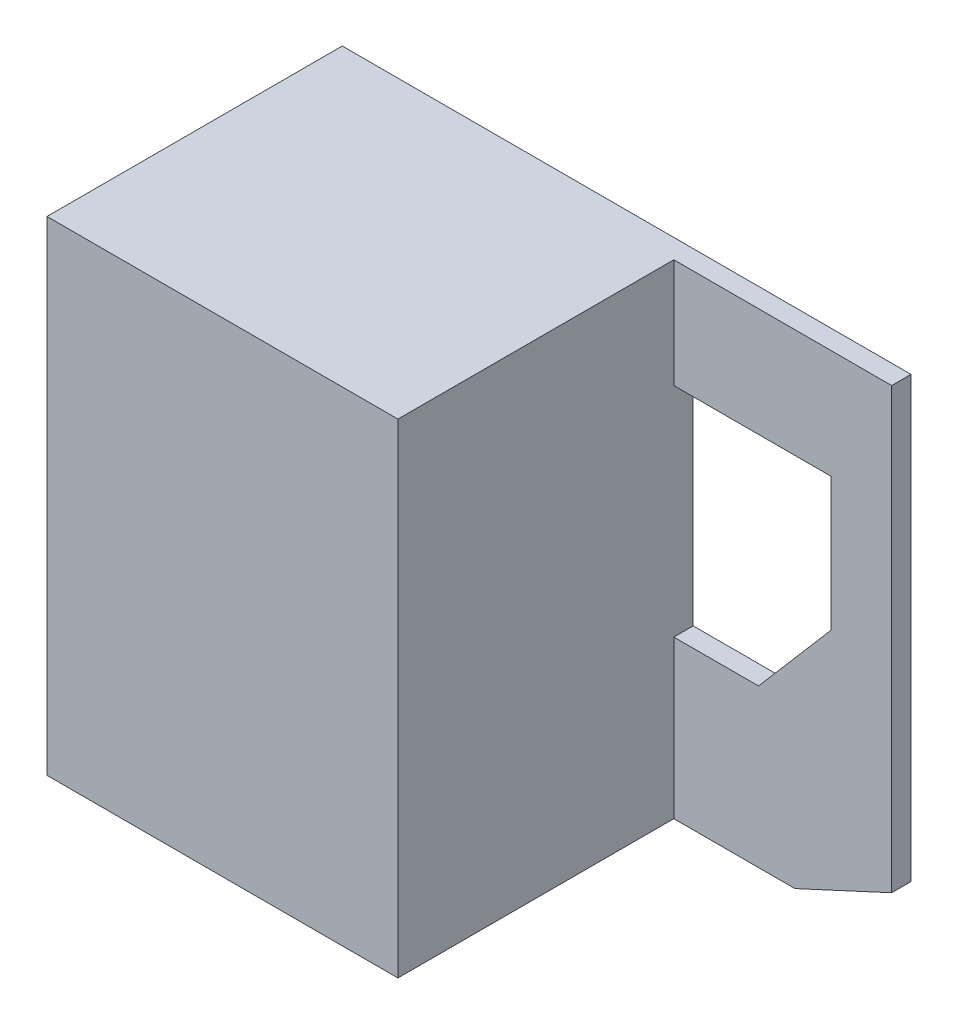
ISO-10303-21;
HEADER;
FILE_DESCRIPTION(('STEP AP214'),'2;1');
FILE_NAME('part.step','',(''),(''),'','','');
FILE_SCHEMA(('AUTOMOTIVE_DESIGN { 1 0 10303 214 1 1 1 1 }'));
ENDSEC;
DATA;
#1=APPLICATION_CONTEXT('core data for automotive mechanical design processes');
#2=APPLICATION_PROTOCOL_DEFINITION('international standard','automotive_design',2000,#1);
#3=PRODUCT_CONTEXT('',#1,'mechanical');
#4=PRODUCT('Part','Part','',(#3));
#5=PRODUCT_RELATED_PRODUCT_CATEGORY('part','',(#4));
#6=PRODUCT_DEFINITION_FORMATION('','',#4);
#7=PRODUCT_DEFINITION_CONTEXT('part definition',#1,'design');
#8=PRODUCT_DEFINITION('design','',#6,#7);
#9=PRODUCT_DEFINITION_SHAPE('','',#8);
#10=(LENGTH_UNIT() NAMED_UNIT(*) SI_UNIT(.MILLI.,.METRE.));
#11=(NAMED_UNIT(*) PLANE_ANGLE_UNIT() SI_UNIT($,.RADIAN.));
#12=(NAMED_UNIT(*) SI_UNIT($,.STERADIAN.) SOLID_ANGLE_UNIT());
#13=UNCERTAINTY_MEASURE_WITH_UNIT(LENGTH_MEASURE(1.E-05),#10,'distance_accuracy_value','');
#14=(GEOMETRIC_REPRESENTATION_CONTEXT(3) GLOBAL_UNCERTAINTY_ASSIGNED_CONTEXT((#13)) GLOBAL_UNIT_ASSIGNED_CONTEXT((#10,
#11,#12)) REPRESENTATION_CONTEXT('',''));
#15=CARTESIAN_POINT('',(0.,0.,0.));
#16=DIRECTION('',(0.,0.,1.));
#17=DIRECTION('',(1.,0.,0.));
#18=AXIS2_PLACEMENT_3D('',#15,#16,#17);
#19=CARTESIAN_POINT('',(14.5,-20.,24.4));
#20=DIRECTION('',(-1.,0.,0.));
#21=DIRECTION('',(0.,0.,1.));
#22=AXIS2_PLACEMENT_3D('',#19,#20,#21);
#23=PLANE('',#22);
#24=DIRECTION('',(0.,0.,-1.));
#25=VECTOR('',#24,1.);
#26=CARTESIAN_POINT('',(14.5,11.,1.6));
#27=LINE('',#26,#25);
#28=CARTESIAN_POINT('',(14.5,11.,1.6));
#29=VERTEX_POINT('',#28);
#30=CARTESIAN_POINT('',(14.5,11.,0.));
#31=VERTEX_POINT('',#30);
#32=EDGE_CURVE('E46',#29,#31,#27,.T.);
#33=ORIENTED_EDGE('',*,*,#32,.F.);
#34=DIRECTION('',(0.,-1.,0.));
#35=VECTOR('',#34,1.);
#36=CARTESIAN_POINT('',(14.5,11.,1.6));
#37=LINE('',#36,#35);
#38=CARTESIAN_POINT('',(14.5,20.,1.6));
#39=VERTEX_POINT('',#38);
#40=EDGE_CURVE('E126',#39,#29,#37,.T.);
#41=ORIENTED_EDGE('',*,*,#40,.F.);
#42=DIRECTION('',(0.,0.,-1.));
#43=VECTOR('',#42,1.);
#44=CARTESIAN_POINT('',(14.5,20.,24.4));
#45=LINE('',#44,#43);
#46=CARTESIAN_POINT('',(14.5,20.,24.4));
#47=VERTEX_POINT('',#46);
#48=EDGE_CURVE('E11',#47,#39,#45,.T.);
#49=ORIENTED_EDGE('',*,*,#48,.F.);
#50=DIRECTION('',(0.,1.,0.));
#51=VECTOR('',#50,1.);
#52=CARTESIAN_POINT('',(14.5,-20.,24.4));
#53=LINE('',#52,#51);
#54=CARTESIAN_POINT('',(14.5,-20.,24.4));
#55=VERTEX_POINT('',#54);
#56=EDGE_CURVE('E188',#55,#47,#53,.T.);
#57=ORIENTED_EDGE('',*,*,#56,.F.);
#58=DIRECTION('',(0.,0.,-1.));
#59=VECTOR('',#58,1.);
#60=CARTESIAN_POINT('',(14.5,-20.,24.4));
#61=LINE('',#60,#59);
#62=CARTESIAN_POINT('',(14.5,-20.,1.6));
#63=VERTEX_POINT('',#62);
#64=EDGE_CURVE('E198',#55,#63,#61,.T.);
#65=ORIENTED_EDGE('',*,*,#64,.T.);
#66=DIRECTION('',(0.,-1.,0.));
#67=VECTOR('',#66,1.);
#68=CARTESIAN_POINT('',(14.5,-20.,1.6));
#69=LINE('',#68,#67);
#70=CARTESIAN_POINT('',(14.5,-7.,1.6));
#71=VERTEX_POINT('',#70);
#72=EDGE_CURVE('E53',#71,#63,#69,.T.);
#73=ORIENTED_EDGE('',*,*,#72,.F.);
#74=DIRECTION('',(0.,0.,-1.));
#75=VECTOR('',#74,1.);
#76=CARTESIAN_POINT('',(14.5,-7.,1.6));
#77=LINE('',#76,#75);
#78=CARTESIAN_POINT('',(14.5,-7.,0.));
#79=VERTEX_POINT('',#78);
#80=EDGE_CURVE('E180',#71,#79,#77,.T.);
#81=ORIENTED_EDGE('',*,*,#80,.T.);
#82=DIRECTION('',(0.,1.,0.));
#83=VECTOR('',#82,1.);
#84=CARTESIAN_POINT('',(14.5,-20.,0.));
#85=LINE('',#84,#83);
#86=EDGE_CURVE('E187',#79,#31,#85,.T.);
#87=ORIENTED_EDGE('',*,*,#86,.T.);
#88=EDGE_LOOP('',(#33,#41,#49,#57,#65,#73,#81,#87));
#89=FACE_BOUND('',#88,.T.);
#90=ADVANCED_FACE('F32',(#89),#23,.F.);
#91=CARTESIAN_POINT('',(-14.5,20.,24.4));
#92=DIRECTION('',(0.,-1.,0.));
#93=DIRECTION('',(0.,0.,-1.));
#94=AXIS2_PLACEMENT_3D('',#91,#92,#93);
#95=PLANE('',#94);
#96=DIRECTION('',(-1.,0.,0.));
#97=VECTOR('',#96,1.);
#98=CARTESIAN_POINT('',(-14.5,20.,0.));
#99=LINE('',#98,#97);
#100=CARTESIAN_POINT('',(32.5,20.,0.));
#101=VERTEX_POINT('',#100);
#102=CARTESIAN_POINT('',(-14.5,20.,0.));
#103=VERTEX_POINT('',#102);
#104=EDGE_CURVE('E200',#101,#103,#99,.T.);
#105=ORIENTED_EDGE('',*,*,#104,.T.);
#106=DIRECTION('',(0.,0.,-1.));
#107=VECTOR('',#106,1.);
#108=CARTESIAN_POINT('',(-14.5,20.,24.4));
#109=LINE('',#108,#107);
#110=CARTESIAN_POINT('',(-14.5,20.,24.4));
#111=VERTEX_POINT('',#110);
#112=EDGE_CURVE('E39',#111,#103,#109,.T.);
#113=ORIENTED_EDGE('',*,*,#112,.F.);
#114=DIRECTION('',(-1.,0.,0.));
#115=VECTOR('',#114,1.);
#116=CARTESIAN_POINT('',(-14.5,20.,24.4));
#117=LINE('',#116,#115);
#118=EDGE_CURVE('E191',#47,#111,#117,.T.);
#119=ORIENTED_EDGE('',*,*,#118,.F.);
#120=ORIENTED_EDGE('',*,*,#48,.T.);
#121=DIRECTION('',(-1.,0.,0.));
#122=VECTOR('',#121,1.);
#123=CARTESIAN_POINT('',(14.5,20.,1.6));
#124=LINE('',#123,#122);
#125=CARTESIAN_POINT('',(32.5,20.,1.6));
#126=VERTEX_POINT('',#125);
#127=EDGE_CURVE('E155',#126,#39,#124,.T.);
#128=ORIENTED_EDGE('',*,*,#127,.F.);
#129=DIRECTION('',(0.,0.,-1.));
#130=VECTOR('',#129,1.);
#131=CARTESIAN_POINT('',(32.5,20.,1.6));
#132=LINE('',#131,#130);
#133=EDGE_CURVE('E157',#126,#101,#132,.T.);
#134=ORIENTED_EDGE('',*,*,#133,.T.);
#135=EDGE_LOOP('',(#105,#113,#119,#120,#128,#134));
#136=FACE_BOUND('',#135,.T.);
#137=ADVANCED_FACE('F237',(#136),#95,.F.);
#138=CARTESIAN_POINT('',(-14.5,-20.,24.4));
#139=DIRECTION('',(1.,0.,0.));
#140=DIRECTION('',(0.,0.,-1.));
#141=AXIS2_PLACEMENT_3D('',#138,#139,#140);
#142=PLANE('',#141);
#143=DIRECTION('',(0.,-1.,0.));
#144=VECTOR('',#143,1.);
#145=CARTESIAN_POINT('',(-14.5,-20.,0.));
#146=LINE('',#145,#144);
#147=CARTESIAN_POINT('',(-14.5,-20.,0.));
#148=VERTEX_POINT('',#147);
#149=EDGE_CURVE('E202',#103,#148,#146,.T.);
#150=ORIENTED_EDGE('',*,*,#149,.T.);
#151=DIRECTION('',(0.,0.,-1.));
#152=VECTOR('',#151,1.);
#153=CARTESIAN_POINT('',(-14.5,-20.,24.4));
#154=LINE('',#153,#152);
#155=CARTESIAN_POINT('',(-14.5,-20.,24.4));
#156=VERTEX_POINT('',#155);
#157=EDGE_CURVE('E206',#156,#148,#154,.T.);
#158=ORIENTED_EDGE('',*,*,#157,.F.);
#159=DIRECTION('',(0.,-1.,0.));
#160=VECTOR('',#159,1.);
#161=CARTESIAN_POINT('',(-14.5,-20.,24.4));
#162=LINE('',#161,#160);
#163=EDGE_CURVE('E194',#111,#156,#162,.T.);
#164=ORIENTED_EDGE('',*,*,#163,.F.);
#165=ORIENTED_EDGE('',*,*,#112,.T.);
#166=EDGE_LOOP('',(#150,#158,#164,#165));
#167=FACE_BOUND('',#166,.T.);
#168=ADVANCED_FACE('F213',(#167),#142,.F.);
#169=CARTESIAN_POINT('',(-14.5,-20.,24.4));
#170=DIRECTION('',(0.,1.,0.));
#171=DIRECTION('',(0.,0.,1.));
#172=AXIS2_PLACEMENT_3D('',#169,#170,#171);
#173=PLANE('',#172);
#174=CARTESIAN_POINT('',(0.,-20.,13.));
#175=DIRECTION('',(0.,-1.,0.));
#176=DIRECTION('',(0.,0.,-1.));
#177=AXIS2_PLACEMENT_3D('',#174,#175,#176);
#178=CIRCLE('',#177,5.);
#179=CARTESIAN_POINT('',(0.,-20.,8.));
#180=VERTEX_POINT('',#179);
#181=EDGE_CURVE('E335',#180,#180,#178,.T.);
#182=ORIENTED_EDGE('',*,*,#181,.F.);
#183=EDGE_LOOP('',(#182));
#184=FACE_BOUND('',#183,.T.);
#185=DIRECTION('',(1.,0.,0.));
#186=VECTOR('',#185,1.);
#187=CARTESIAN_POINT('',(-14.5,-20.,0.));
#188=LINE('',#187,#186);
#189=CARTESIAN_POINT('',(24.5,-20.,0.));
#190=VERTEX_POINT('',#189);
#191=EDGE_CURVE('E192',#148,#190,#188,.T.);
#192=ORIENTED_EDGE('',*,*,#191,.T.);
#193=DIRECTION('',(0.,0.,-1.));
#194=VECTOR('',#193,1.);
#195=CARTESIAN_POINT('',(24.5,-20.,1.6));
#196=LINE('',#195,#194);
#197=CARTESIAN_POINT('',(24.5,-20.,1.6));
#198=VERTEX_POINT('',#197);
#199=EDGE_CURVE('E177',#198,#190,#196,.T.);
#200=ORIENTED_EDGE('',*,*,#199,.F.);
#201=DIRECTION('',(1.,0.,0.));
#202=VECTOR('',#201,1.);
#203=CARTESIAN_POINT('',(24.5,-20.,1.6));
#204=LINE('',#203,#202);
#205=EDGE_CURVE('E149',#63,#198,#204,.T.);
#206=ORIENTED_EDGE('',*,*,#205,.F.);
#207=ORIENTED_EDGE('',*,*,#64,.F.);
#208=DIRECTION('',(1.,0.,0.));
#209=VECTOR('',#208,1.);
#210=CARTESIAN_POINT('',(-14.5,-20.,24.4));
#211=LINE('',#210,#209);
#212=EDGE_CURVE('E196',#156,#55,#211,.T.);
#213=ORIENTED_EDGE('',*,*,#212,.F.);
#214=ORIENTED_EDGE('',*,*,#157,.T.);
#215=EDGE_LOOP('',(#192,#200,#206,#207,#213,#214));
#216=FACE_BOUND('',#215,.T.);
#217=ADVANCED_FACE('F223',(#184,#216),#173,.F.);
#218=CARTESIAN_POINT('',(0.,0.,24.4));
#219=DIRECTION('',(0.,0.,-1.));
#220=DIRECTION('',(-1.,0.,0.));
#221=AXIS2_PLACEMENT_3D('',#218,#219,#220);
#222=PLANE('',#221);
#223=ORIENTED_EDGE('',*,*,#56,.T.);
#224=ORIENTED_EDGE('',*,*,#118,.T.);
#225=ORIENTED_EDGE('',*,*,#163,.T.);
#226=ORIENTED_EDGE('',*,*,#212,.T.);
#227=EDGE_LOOP('',(#223,#224,#225,#226));
#228=FACE_BOUND('',#227,.T.);
#229=ADVANCED_FACE('F236',(#228),#222,.F.);
#230=CARTESIAN_POINT('',(0.,0.,0.));
#231=DIRECTION('',(0.,0.,-1.));
#232=DIRECTION('',(-1.,0.,0.));
#233=AXIS2_PLACEMENT_3D('',#230,#231,#232);
#234=PLANE('',#233);
#235=DIRECTION('',(1.,0.,0.));
#236=VECTOR('',#235,1.);
#237=CARTESIAN_POINT('',(14.5,11.,0.));
#238=LINE('',#237,#236);
#239=CARTESIAN_POINT('',(27.5,11.,0.));
#240=VERTEX_POINT('',#239);
#241=EDGE_CURVE('E133',#31,#240,#238,.T.);
#242=ORIENTED_EDGE('',*,*,#241,.F.);
#243=ORIENTED_EDGE('',*,*,#86,.F.);
#244=DIRECTION('',(-1.,0.,0.));
#245=VECTOR('',#244,1.);
#246=CARTESIAN_POINT('',(21.5,-7.,0.));
#247=LINE('',#246,#245);
#248=CARTESIAN_POINT('',(21.5,-7.,0.));
#249=VERTEX_POINT('',#248);
#250=EDGE_CURVE('E164',#249,#79,#247,.T.);
#251=ORIENTED_EDGE('',*,*,#250,.F.);
#252=DIRECTION('',(-0.650791373455969,-0.759256602365296,0.));
#253=VECTOR('',#252,1.);
#254=CARTESIAN_POINT('',(27.5,0.,0.));
#255=LINE('',#254,#253);
#256=CARTESIAN_POINT('',(27.5,0.,0.));
#257=VERTEX_POINT('',#256);
#258=EDGE_CURVE('E162',#257,#249,#255,.T.);
#259=ORIENTED_EDGE('',*,*,#258,.F.);
#260=DIRECTION('',(0.,-1.,0.));
#261=VECTOR('',#260,1.);
#262=CARTESIAN_POINT('',(27.5,11.,0.));
#263=LINE('',#262,#261);
#264=EDGE_CURVE('E159',#240,#257,#263,.T.);
#265=ORIENTED_EDGE('',*,*,#264,.F.);
#266=EDGE_LOOP('',(#242,#243,#251,#259,#265));
#267=FACE_BOUND('',#266,.T.);
#268=ORIENTED_EDGE('',*,*,#104,.F.);
#269=DIRECTION('',(0.,1.,0.));
#270=VECTOR('',#269,1.);
#271=CARTESIAN_POINT('',(32.5,20.,0.));
#272=LINE('',#271,#270);
#273=CARTESIAN_POINT('',(32.5,-16.3,0.));
#274=VERTEX_POINT('',#273);
#275=EDGE_CURVE('E169',#274,#101,#272,.T.);
#276=ORIENTED_EDGE('',*,*,#275,.F.);
#277=DIRECTION('',(0.907627040779315,0.419777506360433,0.));
#278=VECTOR('',#277,1.);
#279=CARTESIAN_POINT('',(32.5,-16.3,0.));
#280=LINE('',#279,#278);
#281=EDGE_CURVE('E167',#190,#274,#280,.T.);
#282=ORIENTED_EDGE('',*,*,#281,.F.);
#283=ORIENTED_EDGE('',*,*,#191,.F.);
#284=ORIENTED_EDGE('',*,*,#149,.F.);
#285=EDGE_LOOP('',(#268,#276,#282,#283,#284));
#286=FACE_BOUND('',#285,.T.);
#287=ADVANCED_FACE('F218',(#267,#286),#234,.T.);
#288=CARTESIAN_POINT('',(14.5,11.,1.6));
#289=DIRECTION('',(0.,1.,0.));
#290=DIRECTION('',(0.,0.,1.));
#291=AXIS2_PLACEMENT_3D('',#288,#289,#290);
#292=PLANE('',#291);
#293=ORIENTED_EDGE('',*,*,#241,.T.);
#294=DIRECTION('',(0.,0.,-1.));
#295=VECTOR('',#294,1.);
#296=CARTESIAN_POINT('',(27.5,11.,1.6));
#297=LINE('',#296,#295);
#298=CARTESIAN_POINT('',(27.5,11.,1.6));
#299=VERTEX_POINT('',#298);
#300=EDGE_CURVE('E130',#299,#240,#297,.T.);
#301=ORIENTED_EDGE('',*,*,#300,.F.);
#302=DIRECTION('',(1.,0.,0.));
#303=VECTOR('',#302,1.);
#304=CARTESIAN_POINT('',(14.5,11.,1.6));
#305=LINE('',#304,#303);
#306=EDGE_CURVE('E119',#29,#299,#305,.T.);
#307=ORIENTED_EDGE('',*,*,#306,.F.);
#308=ORIENTED_EDGE('',*,*,#32,.T.);
#309=EDGE_LOOP('',(#293,#301,#307,#308));
#310=FACE_BOUND('',#309,.T.);
#311=ADVANCED_FACE('F131',(#310),#292,.F.);
#312=CARTESIAN_POINT('',(27.5,11.,1.6));
#313=DIRECTION('',(1.,0.,0.));
#314=DIRECTION('',(0.,0.,-1.));
#315=AXIS2_PLACEMENT_3D('',#312,#313,#314);
#316=PLANE('',#315);
#317=ORIENTED_EDGE('',*,*,#264,.T.);
#318=DIRECTION('',(0.,0.,-1.));
#319=VECTOR('',#318,1.);
#320=CARTESIAN_POINT('',(27.5,0.,1.6));
#321=LINE('',#320,#319);
#322=CARTESIAN_POINT('',(27.5,0.,1.6));
#323=VERTEX_POINT('',#322);
#324=EDGE_CURVE('E136',#323,#257,#321,.T.);
#325=ORIENTED_EDGE('',*,*,#324,.F.);
#326=DIRECTION('',(0.,-1.,0.));
#327=VECTOR('',#326,1.);
#328=CARTESIAN_POINT('',(27.5,11.,1.6));
#329=LINE('',#328,#327);
#330=EDGE_CURVE('E123',#299,#323,#329,.T.);
#331=ORIENTED_EDGE('',*,*,#330,.F.);
#332=ORIENTED_EDGE('',*,*,#300,.T.);
#333=EDGE_LOOP('',(#317,#325,#331,#332));
#334=FACE_BOUND('',#333,.T.);
#335=ADVANCED_FACE('F138',(#334),#316,.F.);
#336=CARTESIAN_POINT('',(27.5,0.,1.6));
#337=DIRECTION('',(0.759256602365296,-0.650791373455969,0.));
#338=DIRECTION('',(0.650791373455969,0.759256602365296,0.));
#339=AXIS2_PLACEMENT_3D('',#336,#337,#338);
#340=PLANE('',#339);
#341=ORIENTED_EDGE('',*,*,#258,.T.);
#342=DIRECTION('',(0.,0.,-1.));
#343=VECTOR('',#342,1.);
#344=CARTESIAN_POINT('',(21.5,-7.,1.6));
#345=LINE('',#344,#343);
#346=CARTESIAN_POINT('',(21.5,-7.,1.6));
#347=VERTEX_POINT('',#346);
#348=EDGE_CURVE('E182',#347,#249,#345,.T.);
#349=ORIENTED_EDGE('',*,*,#348,.F.);
#350=DIRECTION('',(-0.650791373455969,-0.759256602365296,0.));
#351=VECTOR('',#350,1.);
#352=CARTESIAN_POINT('',(27.5,0.,1.6));
#353=LINE('',#352,#351);
#354=EDGE_CURVE('E141',#323,#347,#353,.T.);
#355=ORIENTED_EDGE('',*,*,#354,.F.);
#356=ORIENTED_EDGE('',*,*,#324,.T.);
#357=EDGE_LOOP('',(#341,#349,#355,#356));
#358=FACE_BOUND('',#357,.T.);
#359=ADVANCED_FACE('F272',(#358),#340,.F.);
#360=CARTESIAN_POINT('',(21.5,-7.,1.6));
#361=DIRECTION('',(0.,-1.,0.));
#362=DIRECTION('',(0.,0.,-1.));
#363=AXIS2_PLACEMENT_3D('',#360,#361,#362);
#364=PLANE('',#363);
#365=ORIENTED_EDGE('',*,*,#250,.T.);
#366=ORIENTED_EDGE('',*,*,#80,.F.);
#367=DIRECTION('',(-1.,0.,0.));
#368=VECTOR('',#367,1.);
#369=CARTESIAN_POINT('',(21.5,-7.,1.6));
#370=LINE('',#369,#368);
#371=EDGE_CURVE('E143',#347,#71,#370,.T.);
#372=ORIENTED_EDGE('',*,*,#371,.F.);
#373=ORIENTED_EDGE('',*,*,#348,.T.);
#374=EDGE_LOOP('',(#365,#366,#372,#373));
#375=FACE_BOUND('',#374,.T.);
#376=ADVANCED_FACE('F249',(#375),#364,.F.);
#377=CARTESIAN_POINT('',(32.5,-16.3,1.6));
#378=DIRECTION('',(-0.419777506360433,0.907627040779315,0.));
#379=DIRECTION('',(-0.907627040779315,-0.419777506360433,0.));
#380=AXIS2_PLACEMENT_3D('',#377,#378,#379);
#381=PLANE('',#380);
#382=ORIENTED_EDGE('',*,*,#281,.T.);
#383=DIRECTION('',(0.,0.,-1.));
#384=VECTOR('',#383,1.);
#385=CARTESIAN_POINT('',(32.5,-16.3,1.6));
#386=LINE('',#385,#384);
#387=CARTESIAN_POINT('',(32.5,-16.3,1.6));
#388=VERTEX_POINT('',#387);
#389=EDGE_CURVE('E174',#388,#274,#386,.T.);
#390=ORIENTED_EDGE('',*,*,#389,.F.);
#391=DIRECTION('',(0.907627040779315,0.419777506360433,0.));
#392=VECTOR('',#391,1.);
#393=CARTESIAN_POINT('',(32.5,-16.3,1.6));
#394=LINE('',#393,#392);
#395=EDGE_CURVE('E151',#198,#388,#394,.T.);
#396=ORIENTED_EDGE('',*,*,#395,.F.);
#397=ORIENTED_EDGE('',*,*,#199,.T.);
#398=EDGE_LOOP('',(#382,#390,#396,#397));
#399=FACE_BOUND('',#398,.T.);
#400=ADVANCED_FACE('F228',(#399),#381,.F.);
#401=CARTESIAN_POINT('',(32.5,20.,1.6));
#402=DIRECTION('',(-1.,0.,0.));
#403=DIRECTION('',(0.,-1.,0.));
#404=AXIS2_PLACEMENT_3D('',#401,#402,#403);
#405=PLANE('',#404);
#406=ORIENTED_EDGE('',*,*,#275,.T.);
#407=ORIENTED_EDGE('',*,*,#133,.F.);
#408=DIRECTION('',(0.,1.,0.));
#409=VECTOR('',#408,1.);
#410=CARTESIAN_POINT('',(32.5,20.,1.6));
#411=LINE('',#410,#409);
#412=EDGE_CURVE('E153',#388,#126,#411,.T.);
#413=ORIENTED_EDGE('',*,*,#412,.F.);
#414=ORIENTED_EDGE('',*,*,#389,.T.);
#415=EDGE_LOOP('',(#406,#407,#413,#414));
#416=FACE_BOUND('',#415,.T.);
#417=ADVANCED_FACE('F240',(#416),#405,.F.);
#418=CARTESIAN_POINT('',(0.,0.,1.6));
#419=DIRECTION('',(0.,0.,-1.));
#420=DIRECTION('',(-1.,0.,0.));
#421=AXIS2_PLACEMENT_3D('',#418,#419,#420);
#422=PLANE('',#421);
#423=ORIENTED_EDGE('',*,*,#40,.T.);
#424=ORIENTED_EDGE('',*,*,#306,.T.);
#425=ORIENTED_EDGE('',*,*,#330,.T.);
#426=ORIENTED_EDGE('',*,*,#354,.T.);
#427=ORIENTED_EDGE('',*,*,#371,.T.);
#428=ORIENTED_EDGE('',*,*,#72,.T.);
#429=ORIENTED_EDGE('',*,*,#205,.T.);
#430=ORIENTED_EDGE('',*,*,#395,.T.);
#431=ORIENTED_EDGE('',*,*,#412,.T.);
#432=ORIENTED_EDGE('',*,*,#127,.T.);
#433=EDGE_LOOP('',(#423,#424,#425,#426,#427,#428,#429,#430,#431,#432));
#434=FACE_BOUND('',#433,.T.);
#435=ADVANCED_FACE('F121',(#434),#422,.F.);
#436=CARTESIAN_POINT('',(0.,14.,13.));
#437=DIRECTION('',(0.,-1.,0.));
#438=DIRECTION('',(0.,0.,-1.));
#439=AXIS2_PLACEMENT_3D('',#436,#437,#438);
#440=CYLINDRICAL_SURFACE('',#439,5.);
#441=CARTESIAN_POINT('',(0.,14.,13.));
#442=DIRECTION('',(0.,-1.,0.));
#443=DIRECTION('',(0.,0.,-1.));
#444=AXIS2_PLACEMENT_3D('',#441,#442,#443);
#445=CIRCLE('',#444,5.);
#446=CARTESIAN_POINT('',(0.,14.,8.));
#447=VERTEX_POINT('',#446);
#448=EDGE_CURVE('E160',#447,#447,#445,.T.);
#449=ORIENTED_EDGE('',*,*,#448,.F.);
#450=EDGE_LOOP('',(#449));
#451=FACE_BOUND('',#450,.T.);
#452=ORIENTED_EDGE('',*,*,#181,.T.);
#453=EDGE_LOOP('',(#452));
#454=FACE_BOUND('',#453,.T.);
#455=ADVANCED_FACE('F247',(#451,#454),#440,.F.);
#456=CARTESIAN_POINT('',(0.,14.,13.));
#457=DIRECTION('',(0.,-1.,0.));
#458=DIRECTION('',(0.,0.,-1.));
#459=AXIS2_PLACEMENT_3D('',#456,#457,#458);
#460=PLANE('',#459);
#461=ORIENTED_EDGE('',*,*,#448,.T.);
#462=EDGE_LOOP('',(#461));
#463=FACE_BOUND('',#462,.T.);
#464=ADVANCED_FACE('F319',(#463),#460,.T.);
#465=CLOSED_SHELL('',(#90,#137,#168,#217,#229,#287,#311,#335,#359,#376,#400,#417,#435,#455,#464));
#466=MANIFOLD_SOLID_BREP('B2',#465);
#467=ADVANCED_BREP_SHAPE_REPRESENTATION('',(#18,#466),#14);
#468=SHAPE_DEFINITION_REPRESENTATION(#9,#467);
ENDSEC;
END-ISO-10303-21;
